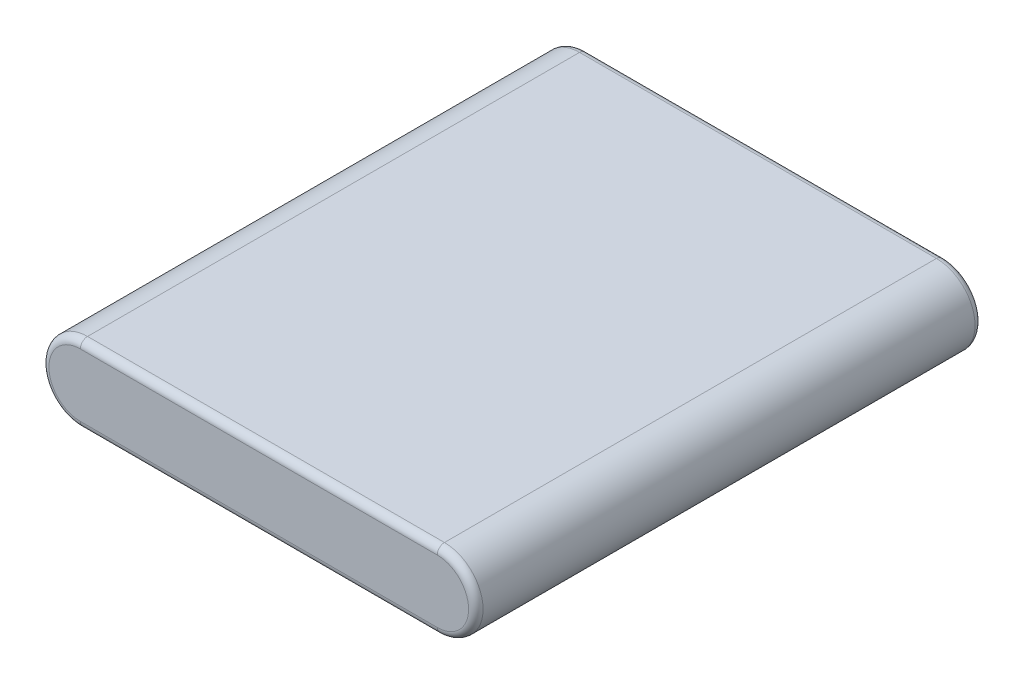
ISO-10303-21;
HEADER;
FILE_DESCRIPTION(('STEP AP214'),'2;1');
FILE_NAME('part.step','',(''),(''),'','','');
FILE_SCHEMA(('AUTOMOTIVE_DESIGN { 1 0 10303 214 1 1 1 1 }'));
ENDSEC;
DATA;
#1=APPLICATION_CONTEXT('core data for automotive mechanical design processes');
#2=APPLICATION_PROTOCOL_DEFINITION('international standard','automotive_design',2000,#1);
#3=PRODUCT_CONTEXT('',#1,'mechanical');
#4=PRODUCT('Part','Part','',(#3));
#5=PRODUCT_RELATED_PRODUCT_CATEGORY('part','',(#4));
#6=PRODUCT_DEFINITION_FORMATION('','',#4);
#7=PRODUCT_DEFINITION_CONTEXT('part definition',#1,'design');
#8=PRODUCT_DEFINITION('design','',#6,#7);
#9=PRODUCT_DEFINITION_SHAPE('','',#8);
#10=(LENGTH_UNIT() NAMED_UNIT(*) SI_UNIT(.MILLI.,.METRE.));
#11=(NAMED_UNIT(*) PLANE_ANGLE_UNIT() SI_UNIT($,.RADIAN.));
#12=(NAMED_UNIT(*) SI_UNIT($,.STERADIAN.) SOLID_ANGLE_UNIT());
#13=UNCERTAINTY_MEASURE_WITH_UNIT(LENGTH_MEASURE(1.E-05),#10,'distance_accuracy_value','');
#14=(GEOMETRIC_REPRESENTATION_CONTEXT(3) GLOBAL_UNCERTAINTY_ASSIGNED_CONTEXT((#13)) GLOBAL_UNIT_ASSIGNED_CONTEXT((#10,
#11,#12)) REPRESENTATION_CONTEXT('',''));
#15=CARTESIAN_POINT('',(0.,0.,0.));
#16=DIRECTION('',(0.,0.,1.));
#17=DIRECTION('',(1.,0.,0.));
#18=AXIS2_PLACEMENT_3D('',#15,#16,#17);
#19=CARTESIAN_POINT('',(37.,0.,52.5));
#20=DIRECTION('',(0.,0.,-1.));
#21=DIRECTION('',(-1.,0.,0.));
#22=AXIS2_PLACEMENT_3D('',#19,#20,#21);
#23=CYLINDRICAL_SURFACE('',#22,7.99999999999999);
#24=DIRECTION('',(0.,0.,-1.));
#25=VECTOR('',#24,1.);
#26=CARTESIAN_POINT('',(37.,-7.99999999999998,52.5));
#27=LINE('',#26,#25);
#28=CARTESIAN_POINT('',(37.,-7.99999999999998,51.));
#29=VERTEX_POINT('',#28);
#30=CARTESIAN_POINT('',(37.,-7.99999999999998,-51.));
#31=VERTEX_POINT('',#30);
#32=EDGE_CURVE('E144',#29,#31,#27,.T.);
#33=ORIENTED_EDGE('',*,*,#32,.T.);
#34=CARTESIAN_POINT('',(37.,0.,-51.));
#35=DIRECTION('',(0.,0.,1.));
#36=DIRECTION('',(1.,0.,0.));
#37=AXIS2_PLACEMENT_3D('',#34,#35,#36);
#38=CIRCLE('',#37,7.99999999999999);
#39=CARTESIAN_POINT('',(37.,8.00000000000001,-51.));
#40=VERTEX_POINT('',#39);
#41=EDGE_CURVE('E153',#31,#40,#38,.T.);
#42=ORIENTED_EDGE('',*,*,#41,.T.);
#43=DIRECTION('',(0.,0.,-1.));
#44=VECTOR('',#43,1.);
#45=CARTESIAN_POINT('',(37.,8.00000000000001,52.5));
#46=LINE('',#45,#44);
#47=CARTESIAN_POINT('',(37.,8.00000000000001,51.));
#48=VERTEX_POINT('',#47);
#49=EDGE_CURVE('E122',#48,#40,#46,.T.);
#50=ORIENTED_EDGE('',*,*,#49,.F.);
#51=CARTESIAN_POINT('',(37.,0.,51.));
#52=DIRECTION('',(0.,0.,1.));
#53=DIRECTION('',(1.,0.,0.));
#54=AXIS2_PLACEMENT_3D('',#51,#52,#53);
#55=CIRCLE('',#54,7.99999999999999);
#56=EDGE_CURVE('E155',#48,#29,#55,.F.);
#57=ORIENTED_EDGE('',*,*,#56,.T.);
#58=EDGE_LOOP('',(#33,#42,#50,#57));
#59=FACE_BOUND('',#58,.T.);
#60=ADVANCED_FACE('F35',(#59),#23,.T.);
#61=CARTESIAN_POINT('',(37.,8.00000000000001,52.5));
#62=DIRECTION('',(0.,-1.,0.));
#63=DIRECTION('',(1.,0.,0.));
#64=AXIS2_PLACEMENT_3D('',#61,#62,#63);
#65=PLANE('',#64);
#66=ORIENTED_EDGE('',*,*,#49,.T.);
#67=DIRECTION('',(-1.,0.,0.));
#68=VECTOR('',#67,1.);
#69=CARTESIAN_POINT('',(37.,8.00000000000001,-51.));
#70=LINE('',#69,#68);
#71=CARTESIAN_POINT('',(-37.,8.00000000000001,-51.));
#72=VERTEX_POINT('',#71);
#73=EDGE_CURVE('E121',#40,#72,#70,.T.);
#74=ORIENTED_EDGE('',*,*,#73,.T.);
#75=DIRECTION('',(0.,0.,-1.));
#76=VECTOR('',#75,1.);
#77=CARTESIAN_POINT('',(-37.,8.00000000000001,52.5));
#78=LINE('',#77,#76);
#79=CARTESIAN_POINT('',(-37.,8.00000000000001,51.));
#80=VERTEX_POINT('',#79);
#81=EDGE_CURVE('E104',#80,#72,#78,.T.);
#82=ORIENTED_EDGE('',*,*,#81,.F.);
#83=DIRECTION('',(-1.,0.,0.));
#84=VECTOR('',#83,1.);
#85=CARTESIAN_POINT('',(37.,8.00000000000001,51.));
#86=LINE('',#85,#84);
#87=EDGE_CURVE('E118',#80,#48,#86,.F.);
#88=ORIENTED_EDGE('',*,*,#87,.T.);
#89=EDGE_LOOP('',(#66,#74,#82,#88));
#90=FACE_BOUND('',#89,.T.);
#91=ADVANCED_FACE('F117',(#90),#65,.F.);
#92=CARTESIAN_POINT('',(-37.,0.,52.5));
#93=DIRECTION('',(0.,0.,-1.));
#94=DIRECTION('',(-1.,0.,0.));
#95=AXIS2_PLACEMENT_3D('',#92,#93,#94);
#96=CYLINDRICAL_SURFACE('',#95,8.);
#97=ORIENTED_EDGE('',*,*,#81,.T.);
#98=CARTESIAN_POINT('',(-37.,0.,-51.));
#99=DIRECTION('',(0.,0.,1.));
#100=DIRECTION('',(1.,0.,0.));
#101=AXIS2_PLACEMENT_3D('',#98,#99,#100);
#102=CIRCLE('',#101,8.);
#103=CARTESIAN_POINT('',(-37.,-7.99999999999999,-51.));
#104=VERTEX_POINT('',#103);
#105=EDGE_CURVE('E110',#72,#104,#102,.T.);
#106=ORIENTED_EDGE('',*,*,#105,.T.);
#107=DIRECTION('',(0.,0.,-1.));
#108=VECTOR('',#107,1.);
#109=CARTESIAN_POINT('',(-37.,-7.99999999999999,52.5));
#110=LINE('',#109,#108);
#111=CARTESIAN_POINT('',(-37.,-7.99999999999999,51.));
#112=VERTEX_POINT('',#111);
#113=EDGE_CURVE('E106',#112,#104,#110,.T.);
#114=ORIENTED_EDGE('',*,*,#113,.F.);
#115=CARTESIAN_POINT('',(-37.,0.,51.));
#116=DIRECTION('',(0.,0.,1.));
#117=DIRECTION('',(1.,0.,0.));
#118=AXIS2_PLACEMENT_3D('',#115,#116,#117);
#119=CIRCLE('',#118,8.);
#120=EDGE_CURVE('E101',#112,#80,#119,.F.);
#121=ORIENTED_EDGE('',*,*,#120,.T.);
#122=EDGE_LOOP('',(#97,#106,#114,#121));
#123=FACE_BOUND('',#122,.T.);
#124=ADVANCED_FACE('F103',(#123),#96,.T.);
#125=CARTESIAN_POINT('',(37.,-7.99999999999998,52.5));
#126=DIRECTION('',(0.,1.,0.));
#127=DIRECTION('',(-1.,0.,0.));
#128=AXIS2_PLACEMENT_3D('',#125,#126,#127);
#129=PLANE('',#128);
#130=ORIENTED_EDGE('',*,*,#113,.T.);
#131=DIRECTION('',(1.,0.,0.));
#132=VECTOR('',#131,1.);
#133=CARTESIAN_POINT('',(37.,-7.99999999999998,-51.));
#134=LINE('',#133,#132);
#135=EDGE_CURVE('E157',#104,#31,#134,.T.);
#136=ORIENTED_EDGE('',*,*,#135,.T.);
#137=ORIENTED_EDGE('',*,*,#32,.F.);
#138=DIRECTION('',(1.,0.,0.));
#139=VECTOR('',#138,1.);
#140=CARTESIAN_POINT('',(-37.,-7.99999999999999,51.));
#141=LINE('',#140,#139);
#142=EDGE_CURVE('E159',#29,#112,#141,.F.);
#143=ORIENTED_EDGE('',*,*,#142,.T.);
#144=EDGE_LOOP('',(#130,#136,#137,#143));
#145=FACE_BOUND('',#144,.T.);
#146=ADVANCED_FACE('F197',(#145),#129,.F.);
#147=CARTESIAN_POINT('',(37.,0.,52.5));
#148=DIRECTION('',(0.,0.,1.));
#149=DIRECTION('',(1.,0.,0.));
#150=AXIS2_PLACEMENT_3D('',#147,#148,#149);
#151=PLANE('',#150);
#152=CARTESIAN_POINT('',(-37.,0.,52.5));
#153=DIRECTION('',(0.,0.,1.));
#154=DIRECTION('',(1.,0.,0.));
#155=AXIS2_PLACEMENT_3D('',#152,#153,#154);
#156=CIRCLE('',#155,6.5);
#157=CARTESIAN_POINT('',(-37.,6.50000000000001,52.5));
#158=VERTEX_POINT('',#157);
#159=CARTESIAN_POINT('',(-37.,-6.49999999999999,52.5));
#160=VERTEX_POINT('',#159);
#161=EDGE_CURVE('E44',#158,#160,#156,.T.);
#162=ORIENTED_EDGE('',*,*,#161,.T.);
#163=DIRECTION('',(1.,0.,0.));
#164=VECTOR('',#163,1.);
#165=CARTESIAN_POINT('',(37.,-6.49999999999998,52.5));
#166=LINE('',#165,#164);
#167=CARTESIAN_POINT('',(37.,-6.49999999999998,52.5));
#168=VERTEX_POINT('',#167);
#169=EDGE_CURVE('E11',#160,#168,#166,.T.);
#170=ORIENTED_EDGE('',*,*,#169,.T.);
#171=CARTESIAN_POINT('',(37.,0.,52.5));
#172=DIRECTION('',(0.,0.,1.));
#173=DIRECTION('',(1.,0.,0.));
#174=AXIS2_PLACEMENT_3D('',#171,#172,#173);
#175=CIRCLE('',#174,6.5);
#176=CARTESIAN_POINT('',(37.,6.50000000000001,52.5));
#177=VERTEX_POINT('',#176);
#178=EDGE_CURVE('E151',#168,#177,#175,.T.);
#179=ORIENTED_EDGE('',*,*,#178,.T.);
#180=DIRECTION('',(-1.,0.,0.));
#181=VECTOR('',#180,1.);
#182=CARTESIAN_POINT('',(-37.,6.50000000000001,52.5));
#183=LINE('',#182,#181);
#184=EDGE_CURVE('E55',#177,#158,#183,.T.);
#185=ORIENTED_EDGE('',*,*,#184,.T.);
#186=EDGE_LOOP('',(#162,#170,#179,#185));
#187=FACE_BOUND('',#186,.T.);
#188=ADVANCED_FACE('F203',(#187),#151,.T.);
#189=CARTESIAN_POINT('',(37.,0.,-52.5));
#190=DIRECTION('',(0.,0.,1.));
#191=DIRECTION('',(1.,0.,0.));
#192=AXIS2_PLACEMENT_3D('',#189,#190,#191);
#193=PLANE('',#192);
#194=CARTESIAN_POINT('',(-37.,0.,-52.5));
#195=DIRECTION('',(0.,0.,1.));
#196=DIRECTION('',(1.,0.,0.));
#197=AXIS2_PLACEMENT_3D('',#194,#195,#196);
#198=CIRCLE('',#197,6.5);
#199=CARTESIAN_POINT('',(-37.,-6.49999999999999,-52.5));
#200=VERTEX_POINT('',#199);
#201=CARTESIAN_POINT('',(-37.,6.50000000000001,-52.5));
#202=VERTEX_POINT('',#201);
#203=EDGE_CURVE('E164',#200,#202,#198,.F.);
#204=ORIENTED_EDGE('',*,*,#203,.T.);
#205=DIRECTION('',(-1.,0.,0.));
#206=VECTOR('',#205,1.);
#207=CARTESIAN_POINT('',(37.,6.50000000000001,-52.5));
#208=LINE('',#207,#206);
#209=CARTESIAN_POINT('',(37.,6.50000000000001,-52.5));
#210=VERTEX_POINT('',#209);
#211=EDGE_CURVE('E111',#202,#210,#208,.F.);
#212=ORIENTED_EDGE('',*,*,#211,.T.);
#213=CARTESIAN_POINT('',(37.,0.,-52.5));
#214=DIRECTION('',(0.,0.,1.));
#215=DIRECTION('',(1.,0.,0.));
#216=AXIS2_PLACEMENT_3D('',#213,#214,#215);
#217=CIRCLE('',#216,6.5);
#218=CARTESIAN_POINT('',(37.,-6.49999999999998,-52.5));
#219=VERTEX_POINT('',#218);
#220=EDGE_CURVE('E168',#210,#219,#217,.F.);
#221=ORIENTED_EDGE('',*,*,#220,.T.);
#222=DIRECTION('',(1.,0.,0.));
#223=VECTOR('',#222,1.);
#224=CARTESIAN_POINT('',(37.,-6.49999999999998,-52.5));
#225=LINE('',#224,#223);
#226=EDGE_CURVE('E166',#219,#200,#225,.F.);
#227=ORIENTED_EDGE('',*,*,#226,.T.);
#228=EDGE_LOOP('',(#204,#212,#221,#227));
#229=FACE_BOUND('',#228,.T.);
#230=ADVANCED_FACE('F205',(#229),#193,.F.);
#231=CARTESIAN_POINT('',(37.,-6.49999999999998,-51.));
#232=DIRECTION('',(1.,0.,0.));
#233=DIRECTION('',(0.,1.,0.));
#234=AXIS2_PLACEMENT_3D('',#231,#232,#233);
#235=CYLINDRICAL_SURFACE('',#234,1.5);
#236=CARTESIAN_POINT('',(-37.,-6.49999999999999,-51.));
#237=DIRECTION('',(-1.,0.,0.));
#238=DIRECTION('',(0.,0.,1.));
#239=AXIS2_PLACEMENT_3D('',#236,#237,#238);
#240=CIRCLE('',#239,1.5);
#241=EDGE_CURVE('E145',#200,#104,#240,.T.);
#242=ORIENTED_EDGE('',*,*,#241,.F.);
#243=ORIENTED_EDGE('',*,*,#226,.F.);
#244=CARTESIAN_POINT('',(37.,-6.49999999999998,-51.));
#245=DIRECTION('',(1.,0.,0.));
#246=DIRECTION('',(0.,0.,-1.));
#247=AXIS2_PLACEMENT_3D('',#244,#245,#246);
#248=CIRCLE('',#247,1.5);
#249=EDGE_CURVE('E141',#31,#219,#248,.T.);
#250=ORIENTED_EDGE('',*,*,#249,.F.);
#251=ORIENTED_EDGE('',*,*,#135,.F.);
#252=EDGE_LOOP('',(#242,#243,#250,#251));
#253=FACE_BOUND('',#252,.T.);
#254=ADVANCED_FACE('F184',(#253),#235,.T.);
#255=CARTESIAN_POINT('',(37.,0.,-51.));
#256=DIRECTION('',(0.,0.,1.));
#257=DIRECTION('',(1.,0.,0.));
#258=AXIS2_PLACEMENT_3D('',#255,#256,#257);
#259=TOROIDAL_SURFACE('',#258,6.5,1.5);
#260=ORIENTED_EDGE('',*,*,#249,.T.);
#261=ORIENTED_EDGE('',*,*,#220,.F.);
#262=CARTESIAN_POINT('',(37.,6.50000000000001,-51.));
#263=DIRECTION('',(-1.,0.,0.));
#264=DIRECTION('',(0.,0.,1.));
#265=AXIS2_PLACEMENT_3D('',#262,#263,#264);
#266=CIRCLE('',#265,1.5);
#267=EDGE_CURVE('E132',#40,#210,#266,.T.);
#268=ORIENTED_EDGE('',*,*,#267,.F.);
#269=ORIENTED_EDGE('',*,*,#41,.F.);
#270=EDGE_LOOP('',(#260,#261,#268,#269));
#271=FACE_BOUND('',#270,.T.);
#272=ADVANCED_FACE('F188',(#271),#259,.T.);
#273=CARTESIAN_POINT('',(-37.,0.,-51.));
#274=DIRECTION('',(0.,0.,1.));
#275=DIRECTION('',(1.,0.,0.));
#276=AXIS2_PLACEMENT_3D('',#273,#274,#275);
#277=TOROIDAL_SURFACE('',#276,6.5,1.5);
#278=ORIENTED_EDGE('',*,*,#241,.T.);
#279=ORIENTED_EDGE('',*,*,#105,.F.);
#280=CARTESIAN_POINT('',(-37.,6.50000000000001,-51.));
#281=DIRECTION('',(1.,0.,0.));
#282=DIRECTION('',(0.,0.,-1.));
#283=AXIS2_PLACEMENT_3D('',#280,#281,#282);
#284=CIRCLE('',#283,1.5);
#285=EDGE_CURVE('E131',#202,#72,#284,.T.);
#286=ORIENTED_EDGE('',*,*,#285,.F.);
#287=ORIENTED_EDGE('',*,*,#203,.F.);
#288=EDGE_LOOP('',(#278,#279,#286,#287));
#289=FACE_BOUND('',#288,.T.);
#290=ADVANCED_FACE('F196',(#289),#277,.T.);
#291=CARTESIAN_POINT('',(37.,6.50000000000001,-51.));
#292=DIRECTION('',(-1.,0.,0.));
#293=DIRECTION('',(0.,-1.,0.));
#294=AXIS2_PLACEMENT_3D('',#291,#292,#293);
#295=CYLINDRICAL_SURFACE('',#294,1.5);
#296=ORIENTED_EDGE('',*,*,#267,.T.);
#297=ORIENTED_EDGE('',*,*,#211,.F.);
#298=ORIENTED_EDGE('',*,*,#285,.T.);
#299=ORIENTED_EDGE('',*,*,#73,.F.);
#300=EDGE_LOOP('',(#296,#297,#298,#299));
#301=FACE_BOUND('',#300,.T.);
#302=ADVANCED_FACE('F191',(#301),#295,.T.);
#303=CARTESIAN_POINT('',(37.,6.50000000000001,51.));
#304=DIRECTION('',(1.,0.,0.));
#305=DIRECTION('',(0.,1.,0.));
#306=AXIS2_PLACEMENT_3D('',#303,#304,#305);
#307=CYLINDRICAL_SURFACE('',#306,1.5);
#308=CARTESIAN_POINT('',(37.,6.50000000000001,51.));
#309=DIRECTION('',(1.,0.,0.));
#310=DIRECTION('',(0.,0.,-1.));
#311=AXIS2_PLACEMENT_3D('',#308,#309,#310);
#312=CIRCLE('',#311,1.5);
#313=EDGE_CURVE('E127',#48,#177,#312,.T.);
#314=ORIENTED_EDGE('',*,*,#313,.F.);
#315=ORIENTED_EDGE('',*,*,#87,.F.);
#316=CARTESIAN_POINT('',(-37.,6.50000000000001,51.));
#317=DIRECTION('',(-1.,0.,0.));
#318=DIRECTION('',(0.,0.,1.));
#319=AXIS2_PLACEMENT_3D('',#316,#317,#318);
#320=CIRCLE('',#319,1.5);
#321=EDGE_CURVE('E39',#158,#80,#320,.T.);
#322=ORIENTED_EDGE('',*,*,#321,.F.);
#323=ORIENTED_EDGE('',*,*,#184,.F.);
#324=EDGE_LOOP('',(#314,#315,#322,#323));
#325=FACE_BOUND('',#324,.T.);
#326=ADVANCED_FACE('F37',(#325),#307,.T.);
#327=CARTESIAN_POINT('',(-37.,0.,51.));
#328=DIRECTION('',(0.,0.,1.));
#329=DIRECTION('',(1.,0.,0.));
#330=AXIS2_PLACEMENT_3D('',#327,#328,#329);
#331=TOROIDAL_SURFACE('',#330,6.5,1.5);
#332=ORIENTED_EDGE('',*,*,#321,.T.);
#333=ORIENTED_EDGE('',*,*,#120,.F.);
#334=CARTESIAN_POINT('',(-37.,-6.49999999999999,51.));
#335=DIRECTION('',(1.,0.,0.));
#336=DIRECTION('',(0.,0.,-1.));
#337=AXIS2_PLACEMENT_3D('',#334,#335,#336);
#338=CIRCLE('',#337,1.5);
#339=EDGE_CURVE('E134',#160,#112,#338,.T.);
#340=ORIENTED_EDGE('',*,*,#339,.F.);
#341=ORIENTED_EDGE('',*,*,#161,.F.);
#342=EDGE_LOOP('',(#332,#333,#340,#341));
#343=FACE_BOUND('',#342,.T.);
#344=ADVANCED_FACE('F130',(#343),#331,.T.);
#345=CARTESIAN_POINT('',(37.,0.,51.));
#346=DIRECTION('',(0.,0.,1.));
#347=DIRECTION('',(1.,0.,0.));
#348=AXIS2_PLACEMENT_3D('',#345,#346,#347);
#349=TOROIDAL_SURFACE('',#348,6.5,1.5);
#350=ORIENTED_EDGE('',*,*,#313,.T.);
#351=ORIENTED_EDGE('',*,*,#178,.F.);
#352=CARTESIAN_POINT('',(37.,-6.49999999999998,51.));
#353=DIRECTION('',(-1.,0.,0.));
#354=DIRECTION('',(0.,0.,1.));
#355=AXIS2_PLACEMENT_3D('',#352,#353,#354);
#356=CIRCLE('',#355,1.5);
#357=EDGE_CURVE('E137',#29,#168,#356,.T.);
#358=ORIENTED_EDGE('',*,*,#357,.F.);
#359=ORIENTED_EDGE('',*,*,#56,.F.);
#360=EDGE_LOOP('',(#350,#351,#358,#359));
#361=FACE_BOUND('',#360,.T.);
#362=ADVANCED_FACE('F202',(#361),#349,.T.);
#363=CARTESIAN_POINT('',(37.,-6.49999999999998,51.));
#364=DIRECTION('',(-1.,0.,0.));
#365=DIRECTION('',(0.,-1.,0.));
#366=AXIS2_PLACEMENT_3D('',#363,#364,#365);
#367=CYLINDRICAL_SURFACE('',#366,1.5);
#368=ORIENTED_EDGE('',*,*,#339,.T.);
#369=ORIENTED_EDGE('',*,*,#142,.F.);
#370=ORIENTED_EDGE('',*,*,#357,.T.);
#371=ORIENTED_EDGE('',*,*,#169,.F.);
#372=EDGE_LOOP('',(#368,#369,#370,#371));
#373=FACE_BOUND('',#372,.T.);
#374=ADVANCED_FACE('F200',(#373),#367,.T.);
#375=CLOSED_SHELL('',(#60,#91,#124,#146,#188,#230,#254,#272,#290,#302,#326,#344,#362,#374));
#376=MANIFOLD_SOLID_BREP('B2',#375);
#377=ADVANCED_BREP_SHAPE_REPRESENTATION('',(#18,#376),#14);
#378=SHAPE_DEFINITION_REPRESENTATION(#9,#377);
ENDSEC;
END-ISO-10303-21;
